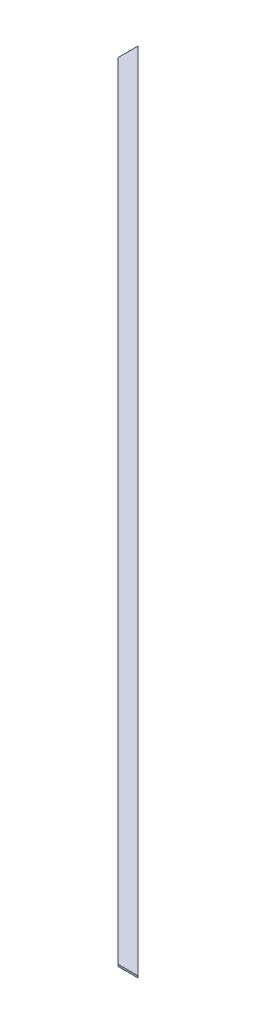
ISO-10303-21;
HEADER;
FILE_DESCRIPTION(('STEP AP214'),'2;1');
FILE_NAME('part.step','',(''),(''),'','','');
FILE_SCHEMA(('AUTOMOTIVE_DESIGN { 1 0 10303 214 1 1 1 1 }'));
ENDSEC;
DATA;
#1=APPLICATION_CONTEXT('core data for automotive mechanical design processes');
#2=APPLICATION_PROTOCOL_DEFINITION('international standard','automotive_design',2000,#1);
#3=PRODUCT_CONTEXT('',#1,'mechanical');
#4=PRODUCT('Part','Part','',(#3));
#5=PRODUCT_RELATED_PRODUCT_CATEGORY('part','',(#4));
#6=PRODUCT_DEFINITION_FORMATION('','',#4);
#7=PRODUCT_DEFINITION_CONTEXT('part definition',#1,'design');
#8=PRODUCT_DEFINITION('design','',#6,#7);
#9=PRODUCT_DEFINITION_SHAPE('','',#8);
#10=(LENGTH_UNIT() NAMED_UNIT(*) SI_UNIT(.MILLI.,.METRE.));
#11=(NAMED_UNIT(*) PLANE_ANGLE_UNIT() SI_UNIT($,.RADIAN.));
#12=(NAMED_UNIT(*) SI_UNIT($,.STERADIAN.) SOLID_ANGLE_UNIT());
#13=UNCERTAINTY_MEASURE_WITH_UNIT(LENGTH_MEASURE(1.E-05),#10,'distance_accuracy_value','');
#14=(GEOMETRIC_REPRESENTATION_CONTEXT(3) GLOBAL_UNCERTAINTY_ASSIGNED_CONTEXT((#13)) GLOBAL_UNIT_ASSIGNED_CONTEXT((#10,
#11,#12)) REPRESENTATION_CONTEXT('',''));
#15=CARTESIAN_POINT('',(0.,0.,0.));
#16=DIRECTION('',(0.,0.,1.));
#17=DIRECTION('',(1.,0.,0.));
#18=AXIS2_PLACEMENT_3D('',#15,#16,#17);
#19=CARTESIAN_POINT('',(0.,6.35,0.));
#20=DIRECTION('',(0.,1.,0.));
#21=DIRECTION('',(0.,0.,1.));
#22=AXIS2_PLACEMENT_3D('',#19,#20,#21);
#23=PLANE('',#22);
#24=DIRECTION('',(0.,0.,1.));
#25=VECTOR('',#24,1.);
#26=CARTESIAN_POINT('',(0.,6.35,-2854.13532214974));
#27=LINE('',#26,#25);
#28=CARTESIAN_POINT('',(0.,6.35,-2782.29327318236));
#29=VERTEX_POINT('',#28);
#30=CARTESIAN_POINT('',(-1.66533453693773E-13,6.35,-2854.13532214974));
#31=VERTEX_POINT('',#30);
#32=EDGE_CURVE('E67',#29,#31,#27,.F.);
#33=ORIENTED_EDGE('',*,*,#32,.F.);
#34=DIRECTION('',(0.707106781186548,0.,0.707106781186548));
#35=VECTOR('',#34,1.);
#36=CARTESIAN_POINT('',(0.,6.35,-2782.29327318236));
#37=LINE('',#36,#35);
#38=CARTESIAN_POINT('',(2782.29327318236,6.35,1.66533453693773E-13));
#39=VERTEX_POINT('',#38);
#40=EDGE_CURVE('E19',#39,#29,#37,.F.);
#41=ORIENTED_EDGE('',*,*,#40,.F.);
#42=DIRECTION('',(1.,0.,0.));
#43=VECTOR('',#42,1.);
#44=CARTESIAN_POINT('',(2782.29327318236,6.35,0.));
#45=LINE('',#44,#43);
#46=CARTESIAN_POINT('',(2854.13532214974,6.35,1.66533453693773E-13));
#47=VERTEX_POINT('',#46);
#48=EDGE_CURVE('E57',#47,#39,#45,.F.);
#49=ORIENTED_EDGE('',*,*,#48,.F.);
#50=DIRECTION('',(-0.707106781186548,0.,-0.707106781186548));
#51=VECTOR('',#50,1.);
#52=CARTESIAN_POINT('',(2854.13532214974,6.35,0.));
#53=LINE('',#52,#51);
#54=EDGE_CURVE('E52',#31,#47,#53,.F.);
#55=ORIENTED_EDGE('',*,*,#54,.F.);
#56=EDGE_LOOP('',(#33,#41,#49,#55));
#57=FACE_BOUND('',#56,.T.);
#58=ADVANCED_FACE('F16',(#57),#23,.T.);
#59=CARTESIAN_POINT('',(0.,0.,-2782.29327318236));
#60=DIRECTION('',(-0.707106781186548,0.,0.707106781186548));
#61=DIRECTION('',(0.707106781186548,0.,0.707106781186548));
#62=AXIS2_PLACEMENT_3D('',#59,#60,#61);
#63=PLANE('',#62);
#64=DIRECTION('',(0.,1.,0.));
#65=VECTOR('',#64,1.);
#66=CARTESIAN_POINT('',(0.,0.,-2782.29327318236));
#67=LINE('',#66,#65);
#68=CARTESIAN_POINT('',(0.,0.,-2782.29327318236));
#69=VERTEX_POINT('',#68);
#70=EDGE_CURVE('E78',#69,#29,#67,.T.);
#71=ORIENTED_EDGE('',*,*,#70,.F.);
#72=DIRECTION('',(0.707106781186548,0.,0.707106781186548));
#73=VECTOR('',#72,1.);
#74=CARTESIAN_POINT('',(0.,0.,-2782.29327318236));
#75=LINE('',#74,#73);
#76=CARTESIAN_POINT('',(2782.29327318236,0.,0.));
#77=VERTEX_POINT('',#76);
#78=EDGE_CURVE('E73',#69,#77,#75,.T.);
#79=ORIENTED_EDGE('',*,*,#78,.T.);
#80=DIRECTION('',(0.,1.,0.));
#81=VECTOR('',#80,1.);
#82=CARTESIAN_POINT('',(2782.29327318236,0.,0.));
#83=LINE('',#82,#81);
#84=EDGE_CURVE('E62',#39,#77,#83,.F.);
#85=ORIENTED_EDGE('',*,*,#84,.F.);
#86=ORIENTED_EDGE('',*,*,#40,.T.);
#87=EDGE_LOOP('',(#71,#79,#85,#86));
#88=FACE_BOUND('',#87,.T.);
#89=ADVANCED_FACE('F72',(#88),#63,.T.);
#90=CARTESIAN_POINT('',(2782.29327318236,0.,0.));
#91=DIRECTION('',(0.,0.,1.));
#92=DIRECTION('',(1.,0.,0.));
#93=AXIS2_PLACEMENT_3D('',#90,#91,#92);
#94=PLANE('',#93);
#95=ORIENTED_EDGE('',*,*,#84,.T.);
#96=DIRECTION('',(1.,0.,0.));
#97=VECTOR('',#96,1.);
#98=CARTESIAN_POINT('',(0.,0.,-3.6095570976608E-13));
#99=LINE('',#98,#97);
#100=CARTESIAN_POINT('',(2854.13532214974,0.,0.));
#101=VERTEX_POINT('',#100);
#102=EDGE_CURVE('E83',#77,#101,#99,.T.);
#103=ORIENTED_EDGE('',*,*,#102,.T.);
#104=DIRECTION('',(0.,1.,0.));
#105=VECTOR('',#104,1.);
#106=CARTESIAN_POINT('',(2854.13532214974,0.,0.));
#107=LINE('',#106,#105);
#108=EDGE_CURVE('E64',#47,#101,#107,.F.);
#109=ORIENTED_EDGE('',*,*,#108,.F.);
#110=ORIENTED_EDGE('',*,*,#48,.T.);
#111=EDGE_LOOP('',(#95,#103,#109,#110));
#112=FACE_BOUND('',#111,.T.);
#113=ADVANCED_FACE('F59',(#112),#94,.T.);
#114=CARTESIAN_POINT('',(2854.13532214974,0.,0.));
#115=DIRECTION('',(0.707106781186548,0.,-0.707106781186548));
#116=DIRECTION('',(-0.707106781186548,0.,-0.707106781186548));
#117=AXIS2_PLACEMENT_3D('',#114,#115,#116);
#118=PLANE('',#117);
#119=ORIENTED_EDGE('',*,*,#108,.T.);
#120=DIRECTION('',(-0.707106781186547,0.,-0.707106781186547));
#121=VECTOR('',#120,1.);
#122=CARTESIAN_POINT('',(2854.13532214974,0.,0.));
#123=LINE('',#122,#121);
#124=CARTESIAN_POINT('',(-3.33066907387547E-13,0.,-2854.13532214974));
#125=VERTEX_POINT('',#124);
#126=EDGE_CURVE('E25',#101,#125,#123,.T.);
#127=ORIENTED_EDGE('',*,*,#126,.T.);
#128=DIRECTION('',(0.,1.,0.));
#129=VECTOR('',#128,1.);
#130=CARTESIAN_POINT('',(0.,0.,-2854.13532214974));
#131=LINE('',#130,#129);
#132=EDGE_CURVE('E33',#31,#125,#131,.F.);
#133=ORIENTED_EDGE('',*,*,#132,.F.);
#134=ORIENTED_EDGE('',*,*,#54,.T.);
#135=EDGE_LOOP('',(#119,#127,#133,#134));
#136=FACE_BOUND('',#135,.T.);
#137=ADVANCED_FACE('F87',(#136),#118,.T.);
#138=CARTESIAN_POINT('',(0.,0.,-2854.13532214974));
#139=DIRECTION('',(-1.,0.,0.));
#140=DIRECTION('',(0.,0.,1.));
#141=AXIS2_PLACEMENT_3D('',#138,#139,#140);
#142=PLANE('',#141);
#143=ORIENTED_EDGE('',*,*,#132,.T.);
#144=DIRECTION('',(0.,0.,1.));
#145=VECTOR('',#144,1.);
#146=CARTESIAN_POINT('',(0.,0.,0.));
#147=LINE('',#146,#145);
#148=EDGE_CURVE('E11',#125,#69,#147,.T.);
#149=ORIENTED_EDGE('',*,*,#148,.T.);
#150=ORIENTED_EDGE('',*,*,#70,.T.);
#151=ORIENTED_EDGE('',*,*,#32,.T.);
#152=EDGE_LOOP('',(#143,#149,#150,#151));
#153=FACE_BOUND('',#152,.T.);
#154=ADVANCED_FACE('F90',(#153),#142,.T.);
#155=CARTESIAN_POINT('',(0.,0.,0.));
#156=DIRECTION('',(0.,1.,0.));
#157=DIRECTION('',(0.,0.,1.));
#158=AXIS2_PLACEMENT_3D('',#155,#156,#157);
#159=PLANE('',#158);
#160=ORIENTED_EDGE('',*,*,#126,.F.);
#161=ORIENTED_EDGE('',*,*,#102,.F.);
#162=ORIENTED_EDGE('',*,*,#78,.F.);
#163=ORIENTED_EDGE('',*,*,#148,.F.);
#164=EDGE_LOOP('',(#160,#161,#162,#163));
#165=FACE_BOUND('',#164,.T.);
#166=ADVANCED_FACE('F89',(#165),#159,.F.);
#167=CLOSED_SHELL('',(#58,#89,#113,#137,#154,#166));
#168=MANIFOLD_SOLID_BREP('B1',#167);
#169=ADVANCED_BREP_SHAPE_REPRESENTATION('',(#18,#168),#14);
#170=SHAPE_DEFINITION_REPRESENTATION(#9,#169);
ENDSEC;
END-ISO-10303-21;
